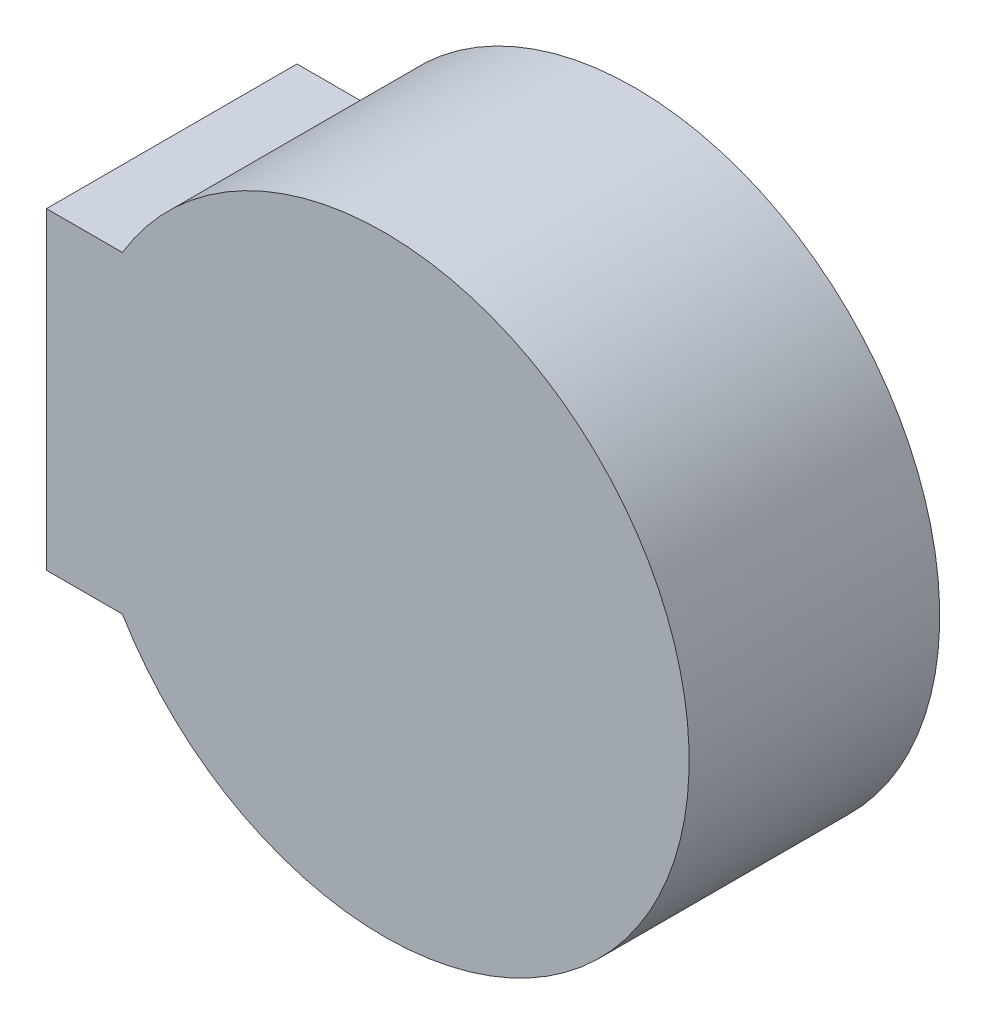
ISO-10303-21;
HEADER;
FILE_DESCRIPTION(('STEP AP214'),'2;1');
FILE_NAME('part.step','',(''),(''),'','','');
FILE_SCHEMA(('AUTOMOTIVE_DESIGN { 1 0 10303 214 1 1 1 1 }'));
ENDSEC;
DATA;
#1=APPLICATION_CONTEXT('core data for automotive mechanical design processes');
#2=APPLICATION_PROTOCOL_DEFINITION('international standard','automotive_design',2000,#1);
#3=PRODUCT_CONTEXT('',#1,'mechanical');
#4=PRODUCT('Part','Part','',(#3));
#5=PRODUCT_RELATED_PRODUCT_CATEGORY('part','',(#4));
#6=PRODUCT_DEFINITION_FORMATION('','',#4);
#7=PRODUCT_DEFINITION_CONTEXT('part definition',#1,'design');
#8=PRODUCT_DEFINITION('design','',#6,#7);
#9=PRODUCT_DEFINITION_SHAPE('','',#8);
#10=(LENGTH_UNIT() NAMED_UNIT(*) SI_UNIT(.MILLI.,.METRE.));
#11=(NAMED_UNIT(*) PLANE_ANGLE_UNIT() SI_UNIT($,.RADIAN.));
#12=(NAMED_UNIT(*) SI_UNIT($,.STERADIAN.) SOLID_ANGLE_UNIT());
#13=UNCERTAINTY_MEASURE_WITH_UNIT(LENGTH_MEASURE(1.E-05),#10,'distance_accuracy_value','');
#14=(GEOMETRIC_REPRESENTATION_CONTEXT(3) GLOBAL_UNCERTAINTY_ASSIGNED_CONTEXT((#13)) GLOBAL_UNIT_ASSIGNED_CONTEXT((#10,
#11,#12)) REPRESENTATION_CONTEXT('',''));
#15=CARTESIAN_POINT('',(0.,0.,0.));
#16=DIRECTION('',(0.,0.,1.));
#17=DIRECTION('',(1.,0.,0.));
#18=AXIS2_PLACEMENT_3D('',#15,#16,#17);
#19=CARTESIAN_POINT('',(0.,0.,11.684));
#20=DIRECTION('',(0.,0.,-1.));
#21=DIRECTION('',(-1.,0.,0.));
#22=AXIS2_PLACEMENT_3D('',#19,#20,#21);
#23=CYLINDRICAL_SURFACE('',#22,14.224);
#24=CARTESIAN_POINT('',(0.,0.,0.));
#25=DIRECTION('',(0.,0.,1.));
#26=DIRECTION('',(1.,0.,0.));
#27=AXIS2_PLACEMENT_3D('',#24,#25,#26);
#28=CIRCLE('',#27,14.224);
#29=CARTESIAN_POINT('',(-12.2063782404938,-7.3025,0.));
#30=VERTEX_POINT('',#29);
#31=CARTESIAN_POINT('',(-12.2063782404938,7.3025,0.));
#32=VERTEX_POINT('',#31);
#33=EDGE_CURVE('E36',#30,#32,#28,.T.);
#34=ORIENTED_EDGE('',*,*,#33,.T.);
#35=DIRECTION('',(0.,0.,-1.));
#36=VECTOR('',#35,1.);
#37=CARTESIAN_POINT('',(-12.2063782404938,7.3025,11.684));
#38=LINE('',#37,#36);
#39=CARTESIAN_POINT('',(-12.2063782404938,7.3025,11.684));
#40=VERTEX_POINT('',#39);
#41=EDGE_CURVE('E50',#32,#40,#38,.F.);
#42=ORIENTED_EDGE('',*,*,#41,.T.);
#43=CARTESIAN_POINT('',(0.,0.,11.684));
#44=DIRECTION('',(0.,0.,1.));
#45=DIRECTION('',(1.,0.,0.));
#46=AXIS2_PLACEMENT_3D('',#43,#44,#45);
#47=CIRCLE('',#46,14.224);
#48=CARTESIAN_POINT('',(-12.2063782404938,-7.3025,11.684));
#49=VERTEX_POINT('',#48);
#50=EDGE_CURVE('E11',#49,#40,#47,.T.);
#51=ORIENTED_EDGE('',*,*,#50,.F.);
#52=DIRECTION('',(0.,0.,-1.));
#53=VECTOR('',#52,1.);
#54=CARTESIAN_POINT('',(-12.2063782404938,-7.3025,11.684));
#55=LINE('',#54,#53);
#56=EDGE_CURVE('E86',#49,#30,#55,.T.);
#57=ORIENTED_EDGE('',*,*,#56,.T.);
#58=EDGE_LOOP('',(#34,#42,#51,#57));
#59=FACE_BOUND('',#58,.T.);
#60=ADVANCED_FACE('F33',(#59),#23,.T.);
#61=CARTESIAN_POINT('',(0.,0.,11.684));
#62=DIRECTION('',(0.,0.,1.));
#63=DIRECTION('',(1.,0.,0.));
#64=AXIS2_PLACEMENT_3D('',#61,#62,#63);
#65=PLANE('',#64);
#66=ORIENTED_EDGE('',*,*,#50,.T.);
#67=DIRECTION('',(-1.,0.,0.));
#68=VECTOR('',#67,1.);
#69=CARTESIAN_POINT('',(-15.748,7.3025,11.684));
#70=LINE('',#69,#68);
#71=CARTESIAN_POINT('',(-15.748,7.3025,11.684));
#72=VERTEX_POINT('',#71);
#73=EDGE_CURVE('E81',#40,#72,#70,.T.);
#74=ORIENTED_EDGE('',*,*,#73,.T.);
#75=DIRECTION('',(0.,-1.,0.));
#76=VECTOR('',#75,1.);
#77=CARTESIAN_POINT('',(-15.748,7.3025,11.684));
#78=LINE('',#77,#76);
#79=CARTESIAN_POINT('',(-15.748,-7.3025,11.684));
#80=VERTEX_POINT('',#79);
#81=EDGE_CURVE('E76',#72,#80,#78,.T.);
#82=ORIENTED_EDGE('',*,*,#81,.T.);
#83=DIRECTION('',(1.,0.,0.));
#84=VECTOR('',#83,1.);
#85=CARTESIAN_POINT('',(-15.748,-7.3025,11.684));
#86=LINE('',#85,#84);
#87=EDGE_CURVE('E84',#80,#49,#86,.T.);
#88=ORIENTED_EDGE('',*,*,#87,.T.);
#89=EDGE_LOOP('',(#66,#74,#82,#88));
#90=FACE_BOUND('',#89,.T.);
#91=ADVANCED_FACE('F89',(#90),#65,.T.);
#92=CARTESIAN_POINT('',(0.,0.,0.));
#93=DIRECTION('',(0.,0.,1.));
#94=DIRECTION('',(1.,0.,0.));
#95=AXIS2_PLACEMENT_3D('',#92,#93,#94);
#96=PLANE('',#95);
#97=ORIENTED_EDGE('',*,*,#33,.F.);
#98=DIRECTION('',(-1.,0.,0.));
#99=VECTOR('',#98,1.);
#100=CARTESIAN_POINT('',(-15.748,-7.3025,0.));
#101=LINE('',#100,#99);
#102=CARTESIAN_POINT('',(-15.748,-7.3025,0.));
#103=VERTEX_POINT('',#102);
#104=EDGE_CURVE('E99',#30,#103,#101,.T.);
#105=ORIENTED_EDGE('',*,*,#104,.T.);
#106=DIRECTION('',(0.,1.,0.));
#107=VECTOR('',#106,1.);
#108=CARTESIAN_POINT('',(-15.748,7.3025,0.));
#109=LINE('',#108,#107);
#110=CARTESIAN_POINT('',(-15.748,7.3025,0.));
#111=VERTEX_POINT('',#110);
#112=EDGE_CURVE('E77',#103,#111,#109,.T.);
#113=ORIENTED_EDGE('',*,*,#112,.T.);
#114=DIRECTION('',(1.,0.,0.));
#115=VECTOR('',#114,1.);
#116=CARTESIAN_POINT('',(-15.748,7.3025,0.));
#117=LINE('',#116,#115);
#118=EDGE_CURVE('E97',#111,#32,#117,.T.);
#119=ORIENTED_EDGE('',*,*,#118,.T.);
#120=EDGE_LOOP('',(#97,#105,#113,#119));
#121=FACE_BOUND('',#120,.T.);
#122=ADVANCED_FACE('F107',(#121),#96,.F.);
#123=CARTESIAN_POINT('',(-15.748,7.3025,-18.2016148109216));
#124=DIRECTION('',(0.,1.,0.));
#125=DIRECTION('',(0.,0.,1.));
#126=AXIS2_PLACEMENT_3D('',#123,#124,#125);
#127=PLANE('',#126);
#128=ORIENTED_EDGE('',*,*,#41,.F.);
#129=ORIENTED_EDGE('',*,*,#118,.F.);
#130=DIRECTION('',(0.,0.,1.));
#131=VECTOR('',#130,1.);
#132=CARTESIAN_POINT('',(-15.748,7.3025,-18.2016148109216));
#133=LINE('',#132,#131);
#134=EDGE_CURVE('E80',#111,#72,#133,.T.);
#135=ORIENTED_EDGE('',*,*,#134,.T.);
#136=ORIENTED_EDGE('',*,*,#73,.F.);
#137=EDGE_LOOP('',(#128,#129,#135,#136));
#138=FACE_BOUND('',#137,.T.);
#139=ADVANCED_FACE('F106',(#138),#127,.T.);
#140=CARTESIAN_POINT('',(-15.748,-7.3025,-18.2016148109216));
#141=DIRECTION('',(0.,-1.,0.));
#142=DIRECTION('',(0.,0.,-1.));
#143=AXIS2_PLACEMENT_3D('',#140,#141,#142);
#144=PLANE('',#143);
#145=ORIENTED_EDGE('',*,*,#56,.F.);
#146=ORIENTED_EDGE('',*,*,#87,.F.);
#147=DIRECTION('',(0.,0.,1.));
#148=VECTOR('',#147,1.);
#149=CARTESIAN_POINT('',(-15.748,-7.3025,-18.2016148109216));
#150=LINE('',#149,#148);
#151=EDGE_CURVE('E71',#103,#80,#150,.T.);
#152=ORIENTED_EDGE('',*,*,#151,.F.);
#153=ORIENTED_EDGE('',*,*,#104,.F.);
#154=EDGE_LOOP('',(#145,#146,#152,#153));
#155=FACE_BOUND('',#154,.T.);
#156=ADVANCED_FACE('F85',(#155),#144,.T.);
#157=CARTESIAN_POINT('',(-15.748,7.3025,-18.2016148109216));
#158=DIRECTION('',(-1.,0.,0.));
#159=DIRECTION('',(0.,0.,1.));
#160=AXIS2_PLACEMENT_3D('',#157,#158,#159);
#161=PLANE('',#160);
#162=ORIENTED_EDGE('',*,*,#112,.F.);
#163=ORIENTED_EDGE('',*,*,#151,.T.);
#164=ORIENTED_EDGE('',*,*,#81,.F.);
#165=ORIENTED_EDGE('',*,*,#134,.F.);
#166=EDGE_LOOP('',(#162,#163,#164,#165));
#167=FACE_BOUND('',#166,.T.);
#168=ADVANCED_FACE('F73',(#167),#161,.T.);
#169=CLOSED_SHELL('',(#60,#91,#122,#139,#156,#168));
#170=MANIFOLD_SOLID_BREP('B2',#169);
#171=ADVANCED_BREP_SHAPE_REPRESENTATION('',(#18,#170),#14);
#172=SHAPE_DEFINITION_REPRESENTATION(#9,#171);
ENDSEC;
END-ISO-10303-21;
